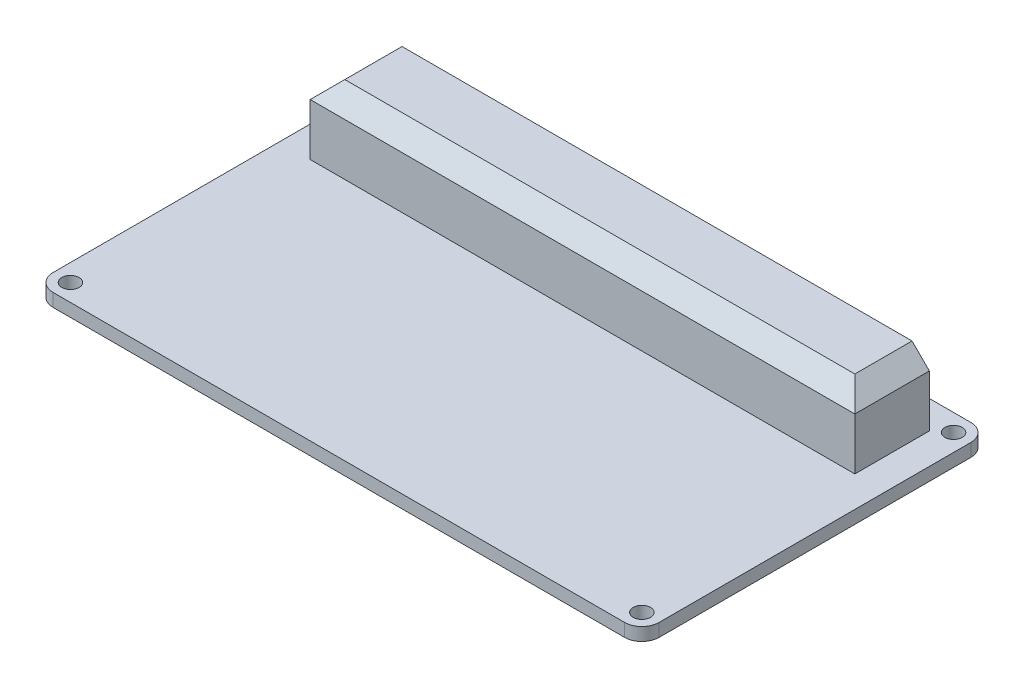
ISO-10303-21;
HEADER;
FILE_DESCRIPTION(('STEP AP214'),'2;1');
FILE_NAME('part.step','',(''),(''),'','','');
FILE_SCHEMA(('AUTOMOTIVE_DESIGN { 1 0 10303 214 1 1 1 1 }'));
ENDSEC;
DATA;
#1=APPLICATION_CONTEXT('core data for automotive mechanical design processes');
#2=APPLICATION_PROTOCOL_DEFINITION('international standard','automotive_design',2000,#1);
#3=PRODUCT_CONTEXT('',#1,'mechanical');
#4=PRODUCT('Part','Part','',(#3));
#5=PRODUCT_RELATED_PRODUCT_CATEGORY('part','',(#4));
#6=PRODUCT_DEFINITION_FORMATION('','',#4);
#7=PRODUCT_DEFINITION_CONTEXT('part definition',#1,'design');
#8=PRODUCT_DEFINITION('design','',#6,#7);
#9=PRODUCT_DEFINITION_SHAPE('','',#8);
#10=(LENGTH_UNIT() NAMED_UNIT(*) SI_UNIT(.MILLI.,.METRE.));
#11=(NAMED_UNIT(*) PLANE_ANGLE_UNIT() SI_UNIT($,.RADIAN.));
#12=(NAMED_UNIT(*) SI_UNIT($,.STERADIAN.) SOLID_ANGLE_UNIT());
#13=UNCERTAINTY_MEASURE_WITH_UNIT(LENGTH_MEASURE(1.E-05),#10,'distance_accuracy_value','');
#14=(GEOMETRIC_REPRESENTATION_CONTEXT(3) GLOBAL_UNCERTAINTY_ASSIGNED_CONTEXT((#13)) GLOBAL_UNIT_ASSIGNED_CONTEXT((#10,
#11,#12)) REPRESENTATION_CONTEXT('',''));
#15=CARTESIAN_POINT('',(0.,0.,0.));
#16=DIRECTION('',(0.,0.,1.));
#17=DIRECTION('',(1.,0.,0.));
#18=AXIS2_PLACEMENT_3D('',#15,#16,#17);
#19=CARTESIAN_POINT('',(0.,1.5,0.));
#20=DIRECTION('',(0.,-1.,0.));
#21=DIRECTION('',(0.,0.,-1.));
#22=AXIS2_PLACEMENT_3D('',#19,#20,#21);
#23=PLANE('',#22);
#24=CARTESIAN_POINT('',(33.,1.5,18.));
#25=DIRECTION('',(0.,1.,0.));
#26=DIRECTION('',(0.,0.,1.));
#27=AXIS2_PLACEMENT_3D('',#24,#25,#26);
#28=CIRCLE('',#27,0.999999999999998);
#29=CARTESIAN_POINT('',(33.,1.5,19.));
#30=VERTEX_POINT('',#29);
#31=EDGE_CURVE('E547',#30,#30,#28,.T.);
#32=ORIENTED_EDGE('',*,*,#31,.F.);
#33=EDGE_LOOP('',(#32));
#34=FACE_BOUND('',#33,.T.);
#35=CARTESIAN_POINT('',(33.,1.5,-18.));
#36=DIRECTION('',(0.,1.,0.));
#37=DIRECTION('',(0.,0.,1.));
#38=AXIS2_PLACEMENT_3D('',#35,#36,#37);
#39=CIRCLE('',#38,0.999999999999998);
#40=CARTESIAN_POINT('',(33.,1.5,-17.));
#41=VERTEX_POINT('',#40);
#42=EDGE_CURVE('E553',#41,#41,#39,.T.);
#43=ORIENTED_EDGE('',*,*,#42,.F.);
#44=EDGE_LOOP('',(#43));
#45=FACE_BOUND('',#44,.T.);
#46=CARTESIAN_POINT('',(-33.,1.5,-18.));
#47=DIRECTION('',(0.,1.,0.));
#48=DIRECTION('',(0.,0.,1.));
#49=AXIS2_PLACEMENT_3D('',#46,#47,#48);
#50=CIRCLE('',#49,0.999999999999998);
#51=CARTESIAN_POINT('',(-33.,1.5,-17.));
#52=VERTEX_POINT('',#51);
#53=EDGE_CURVE('E541',#52,#52,#50,.T.);
#54=ORIENTED_EDGE('',*,*,#53,.F.);
#55=EDGE_LOOP('',(#54));
#56=FACE_BOUND('',#55,.T.);
#57=CARTESIAN_POINT('',(-33.,1.5,18.));
#58=DIRECTION('',(0.,1.,0.));
#59=DIRECTION('',(0.,0.,1.));
#60=AXIS2_PLACEMENT_3D('',#57,#58,#59);
#61=CIRCLE('',#60,0.999999999999998);
#62=CARTESIAN_POINT('',(-33.,1.5,19.));
#63=VERTEX_POINT('',#62);
#64=EDGE_CURVE('E538',#63,#63,#61,.T.);
#65=ORIENTED_EDGE('',*,*,#64,.F.);
#66=EDGE_LOOP('',(#65));
#67=FACE_BOUND('',#66,.T.);
#68=DIRECTION('',(-1.,0.,0.));
#69=VECTOR('',#68,1.);
#70=CARTESIAN_POINT('',(-35.,1.5,-20.));
#71=LINE('',#70,#69);
#72=CARTESIAN_POINT('',(33.,1.5,-20.));
#73=VERTEX_POINT('',#72);
#74=CARTESIAN_POINT('',(-33.,1.5,-20.));
#75=VERTEX_POINT('',#74);
#76=EDGE_CURVE('E187',#73,#75,#71,.T.);
#77=ORIENTED_EDGE('',*,*,#76,.T.);
#78=CARTESIAN_POINT('',(-33.,1.5,-18.));
#79=DIRECTION('',(0.,-1.,0.));
#80=DIRECTION('',(0.,0.,-1.));
#81=AXIS2_PLACEMENT_3D('',#78,#79,#80);
#82=CIRCLE('',#81,2.);
#83=CARTESIAN_POINT('',(-35.,1.5,-18.));
#84=VERTEX_POINT('',#83);
#85=EDGE_CURVE('E248',#75,#84,#82,.F.);
#86=ORIENTED_EDGE('',*,*,#85,.T.);
#87=DIRECTION('',(0.,0.,1.));
#88=VECTOR('',#87,1.);
#89=CARTESIAN_POINT('',(-35.,1.5,20.));
#90=LINE('',#89,#88);
#91=CARTESIAN_POINT('',(-35.,1.5,18.));
#92=VERTEX_POINT('',#91);
#93=EDGE_CURVE('E191',#84,#92,#90,.T.);
#94=ORIENTED_EDGE('',*,*,#93,.T.);
#95=CARTESIAN_POINT('',(-33.,1.5,18.));
#96=DIRECTION('',(0.,-1.,0.));
#97=DIRECTION('',(0.,0.,-1.));
#98=AXIS2_PLACEMENT_3D('',#95,#96,#97);
#99=CIRCLE('',#98,2.);
#100=CARTESIAN_POINT('',(-33.,1.5,20.));
#101=VERTEX_POINT('',#100);
#102=EDGE_CURVE('E65',#92,#101,#99,.F.);
#103=ORIENTED_EDGE('',*,*,#102,.T.);
#104=DIRECTION('',(1.,0.,0.));
#105=VECTOR('',#104,1.);
#106=CARTESIAN_POINT('',(-35.,1.5,20.));
#107=LINE('',#106,#105);
#108=CARTESIAN_POINT('',(33.,1.5,20.));
#109=VERTEX_POINT('',#108);
#110=EDGE_CURVE('E193',#101,#109,#107,.T.);
#111=ORIENTED_EDGE('',*,*,#110,.T.);
#112=CARTESIAN_POINT('',(33.,1.5,18.));
#113=DIRECTION('',(0.,-1.,0.));
#114=DIRECTION('',(0.,0.,-1.));
#115=AXIS2_PLACEMENT_3D('',#112,#113,#114);
#116=CIRCLE('',#115,2.);
#117=CARTESIAN_POINT('',(35.,1.5,18.));
#118=VERTEX_POINT('',#117);
#119=EDGE_CURVE('E244',#109,#118,#116,.F.);
#120=ORIENTED_EDGE('',*,*,#119,.T.);
#121=DIRECTION('',(0.,0.,-1.));
#122=VECTOR('',#121,1.);
#123=CARTESIAN_POINT('',(35.,1.5,20.));
#124=LINE('',#123,#122);
#125=CARTESIAN_POINT('',(35.,1.5,-18.));
#126=VERTEX_POINT('',#125);
#127=EDGE_CURVE('E184',#118,#126,#124,.T.);
#128=ORIENTED_EDGE('',*,*,#127,.T.);
#129=CARTESIAN_POINT('',(33.,1.5,-18.));
#130=DIRECTION('',(0.,-1.,0.));
#131=DIRECTION('',(0.,0.,-1.));
#132=AXIS2_PLACEMENT_3D('',#129,#130,#131);
#133=CIRCLE('',#132,2.);
#134=EDGE_CURVE('E246',#126,#73,#133,.F.);
#135=ORIENTED_EDGE('',*,*,#134,.T.);
#136=EDGE_LOOP('',(#77,#86,#94,#103,#111,#120,#128,#135));
#137=FACE_BOUND('',#136,.T.);
#138=DIRECTION('',(0.,0.,-1.));
#139=VECTOR('',#138,1.);
#140=CARTESIAN_POINT('',(31.4532794988003,1.5,-8.14369626517676));
#141=LINE('',#140,#139);
#142=CARTESIAN_POINT('',(31.4532794988003,1.5,-8.14369626517676));
#143=VERTEX_POINT('',#142);
#144=CARTESIAN_POINT('',(31.4532794988003,1.5,-16.7527571604066));
#145=VERTEX_POINT('',#144);
#146=EDGE_CURVE('E150',#143,#145,#141,.T.);
#147=ORIENTED_EDGE('',*,*,#146,.F.);
#148=DIRECTION('',(1.,0.,0.));
#149=VECTOR('',#148,1.);
#150=CARTESIAN_POINT('',(-31.4532794988003,1.5,-8.14369626517676));
#151=LINE('',#150,#149);
#152=CARTESIAN_POINT('',(-31.4532794988003,1.5,-8.14369626517676));
#153=VERTEX_POINT('',#152);
#154=EDGE_CURVE('E163',#153,#143,#151,.T.);
#155=ORIENTED_EDGE('',*,*,#154,.F.);
#156=DIRECTION('',(0.,0.,1.));
#157=VECTOR('',#156,1.);
#158=CARTESIAN_POINT('',(-31.4532794988003,1.5,-8.14369626517676));
#159=LINE('',#158,#157);
#160=CARTESIAN_POINT('',(-31.4532794988003,1.5,-16.7527571604066));
#161=VERTEX_POINT('',#160);
#162=EDGE_CURVE('E171',#161,#153,#159,.T.);
#163=ORIENTED_EDGE('',*,*,#162,.F.);
#164=DIRECTION('',(-1.,0.,0.));
#165=VECTOR('',#164,1.);
#166=CARTESIAN_POINT('',(-31.4532794988003,1.5,-16.7527571604066));
#167=LINE('',#166,#165);
#168=EDGE_CURVE('E166',#145,#161,#167,.T.);
#169=ORIENTED_EDGE('',*,*,#168,.F.);
#170=EDGE_LOOP('',(#147,#155,#163,#169));
#171=FACE_BOUND('',#170,.T.);
#172=ADVANCED_FACE('F45',(#34,#45,#56,#67,#137,#171),#23,.F.);
#173=CARTESIAN_POINT('',(35.,1.5,20.));
#174=DIRECTION('',(-1.,0.,0.));
#175=DIRECTION('',(0.,0.,1.));
#176=AXIS2_PLACEMENT_3D('',#173,#174,#175);
#177=PLANE('',#176);
#178=DIRECTION('',(0.,0.,-1.));
#179=VECTOR('',#178,1.);
#180=CARTESIAN_POINT('',(35.,0.,20.));
#181=LINE('',#180,#179);
#182=CARTESIAN_POINT('',(35.,0.,18.));
#183=VERTEX_POINT('',#182);
#184=CARTESIAN_POINT('',(35.,0.,-18.));
#185=VERTEX_POINT('',#184);
#186=EDGE_CURVE('E183',#183,#185,#181,.T.);
#187=ORIENTED_EDGE('',*,*,#186,.T.);
#188=DIRECTION('',(0.,-1.,0.));
#189=VECTOR('',#188,1.);
#190=CARTESIAN_POINT('',(35.,1.5,-18.));
#191=LINE('',#190,#189);
#192=EDGE_CURVE('E253',#185,#126,#191,.F.);
#193=ORIENTED_EDGE('',*,*,#192,.T.);
#194=ORIENTED_EDGE('',*,*,#127,.F.);
#195=DIRECTION('',(0.,-1.,0.));
#196=VECTOR('',#195,1.);
#197=CARTESIAN_POINT('',(35.,1.5,18.));
#198=LINE('',#197,#196);
#199=EDGE_CURVE('E250',#118,#183,#198,.T.);
#200=ORIENTED_EDGE('',*,*,#199,.T.);
#201=EDGE_LOOP('',(#187,#193,#194,#200));
#202=FACE_BOUND('',#201,.T.);
#203=ADVANCED_FACE('F269',(#202),#177,.F.);
#204=CARTESIAN_POINT('',(-35.,1.5,-20.));
#205=DIRECTION('',(0.,0.,1.));
#206=DIRECTION('',(1.,0.,0.));
#207=AXIS2_PLACEMENT_3D('',#204,#205,#206);
#208=PLANE('',#207);
#209=DIRECTION('',(-1.,0.,0.));
#210=VECTOR('',#209,1.);
#211=CARTESIAN_POINT('',(-35.,0.,-20.));
#212=LINE('',#211,#210);
#213=CARTESIAN_POINT('',(33.,0.,-20.));
#214=VERTEX_POINT('',#213);
#215=CARTESIAN_POINT('',(-33.,0.,-20.));
#216=VERTEX_POINT('',#215);
#217=EDGE_CURVE('E198',#214,#216,#212,.T.);
#218=ORIENTED_EDGE('',*,*,#217,.T.);
#219=DIRECTION('',(0.,-1.,0.));
#220=VECTOR('',#219,1.);
#221=CARTESIAN_POINT('',(-33.,1.5,-20.));
#222=LINE('',#221,#220);
#223=EDGE_CURVE('E241',#216,#75,#222,.F.);
#224=ORIENTED_EDGE('',*,*,#223,.T.);
#225=ORIENTED_EDGE('',*,*,#76,.F.);
#226=DIRECTION('',(0.,-1.,0.));
#227=VECTOR('',#226,1.);
#228=CARTESIAN_POINT('',(33.,1.5,-20.));
#229=LINE('',#228,#227);
#230=EDGE_CURVE('E238',#73,#214,#229,.T.);
#231=ORIENTED_EDGE('',*,*,#230,.T.);
#232=EDGE_LOOP('',(#218,#224,#225,#231));
#233=FACE_BOUND('',#232,.T.);
#234=ADVANCED_FACE('F278',(#233),#208,.F.);
#235=CARTESIAN_POINT('',(-35.,1.5,20.));
#236=DIRECTION('',(1.,0.,0.));
#237=DIRECTION('',(0.,0.,-1.));
#238=AXIS2_PLACEMENT_3D('',#235,#236,#237);
#239=PLANE('',#238);
#240=ORIENTED_EDGE('',*,*,#93,.F.);
#241=DIRECTION('',(0.,-1.,0.));
#242=VECTOR('',#241,1.);
#243=CARTESIAN_POINT('',(-35.,1.5,-18.));
#244=LINE('',#243,#242);
#245=CARTESIAN_POINT('',(-35.,0.,-18.));
#246=VERTEX_POINT('',#245);
#247=EDGE_CURVE('E227',#84,#246,#244,.T.);
#248=ORIENTED_EDGE('',*,*,#247,.T.);
#249=DIRECTION('',(0.,0.,1.));
#250=VECTOR('',#249,1.);
#251=CARTESIAN_POINT('',(-35.,0.,20.));
#252=LINE('',#251,#250);
#253=CARTESIAN_POINT('',(-35.,0.,18.));
#254=VERTEX_POINT('',#253);
#255=EDGE_CURVE('E201',#246,#254,#252,.T.);
#256=ORIENTED_EDGE('',*,*,#255,.T.);
#257=DIRECTION('',(0.,-1.,0.));
#258=VECTOR('',#257,1.);
#259=CARTESIAN_POINT('',(-35.,1.5,18.));
#260=LINE('',#259,#258);
#261=EDGE_CURVE('E220',#254,#92,#260,.F.);
#262=ORIENTED_EDGE('',*,*,#261,.T.);
#263=EDGE_LOOP('',(#240,#248,#256,#262));
#264=FACE_BOUND('',#263,.T.);
#265=ADVANCED_FACE('F286',(#264),#239,.F.);
#266=CARTESIAN_POINT('',(-35.,1.5,20.));
#267=DIRECTION('',(0.,0.,-1.));
#268=DIRECTION('',(-1.,0.,0.));
#269=AXIS2_PLACEMENT_3D('',#266,#267,#268);
#270=PLANE('',#269);
#271=DIRECTION('',(1.,0.,0.));
#272=VECTOR('',#271,1.);
#273=CARTESIAN_POINT('',(-35.,0.,20.));
#274=LINE('',#273,#272);
#275=CARTESIAN_POINT('',(-33.,0.,20.));
#276=VERTEX_POINT('',#275);
#277=CARTESIAN_POINT('',(33.,0.,20.));
#278=VERTEX_POINT('',#277);
#279=EDGE_CURVE('E188',#276,#278,#274,.T.);
#280=ORIENTED_EDGE('',*,*,#279,.T.);
#281=DIRECTION('',(0.,-1.,0.));
#282=VECTOR('',#281,1.);
#283=CARTESIAN_POINT('',(33.,1.5,20.));
#284=LINE('',#283,#282);
#285=EDGE_CURVE('E11',#278,#109,#284,.F.);
#286=ORIENTED_EDGE('',*,*,#285,.T.);
#287=ORIENTED_EDGE('',*,*,#110,.F.);
#288=DIRECTION('',(0.,-1.,0.));
#289=VECTOR('',#288,1.);
#290=CARTESIAN_POINT('',(-33.,1.5,20.));
#291=LINE('',#290,#289);
#292=EDGE_CURVE('E53',#101,#276,#291,.T.);
#293=ORIENTED_EDGE('',*,*,#292,.T.);
#294=EDGE_LOOP('',(#280,#286,#287,#293));
#295=FACE_BOUND('',#294,.T.);
#296=ADVANCED_FACE('F257',(#295),#270,.F.);
#297=CARTESIAN_POINT('',(0.,0.,0.));
#298=DIRECTION('',(0.,-1.,0.));
#299=DIRECTION('',(0.,0.,-1.));
#300=AXIS2_PLACEMENT_3D('',#297,#298,#299);
#301=PLANE('',#300);
#302=CARTESIAN_POINT('',(33.,0.,18.));
#303=DIRECTION('',(0.,1.,0.));
#304=DIRECTION('',(0.,0.,1.));
#305=AXIS2_PLACEMENT_3D('',#302,#303,#304);
#306=CIRCLE('',#305,0.999999999999998);
#307=CARTESIAN_POINT('',(33.,0.,19.));
#308=VERTEX_POINT('',#307);
#309=EDGE_CURVE('E544',#308,#308,#306,.T.);
#310=ORIENTED_EDGE('',*,*,#309,.T.);
#311=EDGE_LOOP('',(#310));
#312=FACE_BOUND('',#311,.T.);
#313=CARTESIAN_POINT('',(33.,0.,-18.));
#314=DIRECTION('',(0.,1.,0.));
#315=DIRECTION('',(0.,0.,1.));
#316=AXIS2_PLACEMENT_3D('',#313,#314,#315);
#317=CIRCLE('',#316,0.999999999999998);
#318=CARTESIAN_POINT('',(33.,0.,-17.));
#319=VERTEX_POINT('',#318);
#320=EDGE_CURVE('E550',#319,#319,#317,.T.);
#321=ORIENTED_EDGE('',*,*,#320,.T.);
#322=EDGE_LOOP('',(#321));
#323=FACE_BOUND('',#322,.T.);
#324=CARTESIAN_POINT('',(-33.,0.,-18.));
#325=DIRECTION('',(0.,1.,0.));
#326=DIRECTION('',(0.,0.,1.));
#327=AXIS2_PLACEMENT_3D('',#324,#325,#326);
#328=CIRCLE('',#327,0.999999999999998);
#329=CARTESIAN_POINT('',(-33.,0.,-17.));
#330=VERTEX_POINT('',#329);
#331=EDGE_CURVE('E556',#330,#330,#328,.T.);
#332=ORIENTED_EDGE('',*,*,#331,.T.);
#333=EDGE_LOOP('',(#332));
#334=FACE_BOUND('',#333,.T.);
#335=CARTESIAN_POINT('',(-33.,0.,18.));
#336=DIRECTION('',(0.,1.,0.));
#337=DIRECTION('',(0.,0.,1.));
#338=AXIS2_PLACEMENT_3D('',#335,#336,#337);
#339=CIRCLE('',#338,0.999999999999998);
#340=CARTESIAN_POINT('',(-33.,0.,19.));
#341=VERTEX_POINT('',#340);
#342=EDGE_CURVE('E223',#341,#341,#339,.T.);
#343=ORIENTED_EDGE('',*,*,#342,.T.);
#344=EDGE_LOOP('',(#343));
#345=FACE_BOUND('',#344,.T.);
#346=ORIENTED_EDGE('',*,*,#255,.F.);
#347=CARTESIAN_POINT('',(-33.,0.,-18.));
#348=DIRECTION('',(0.,-1.,0.));
#349=DIRECTION('',(0.,0.,-1.));
#350=AXIS2_PLACEMENT_3D('',#347,#348,#349);
#351=CIRCLE('',#350,2.);
#352=EDGE_CURVE('E236',#246,#216,#351,.T.);
#353=ORIENTED_EDGE('',*,*,#352,.T.);
#354=ORIENTED_EDGE('',*,*,#217,.F.);
#355=CARTESIAN_POINT('',(33.,0.,-18.));
#356=DIRECTION('',(0.,-1.,0.));
#357=DIRECTION('',(0.,0.,-1.));
#358=AXIS2_PLACEMENT_3D('',#355,#356,#357);
#359=CIRCLE('',#358,2.);
#360=EDGE_CURVE('E234',#214,#185,#359,.T.);
#361=ORIENTED_EDGE('',*,*,#360,.T.);
#362=ORIENTED_EDGE('',*,*,#186,.F.);
#363=CARTESIAN_POINT('',(33.,0.,18.));
#364=DIRECTION('',(0.,-1.,0.));
#365=DIRECTION('',(0.,0.,-1.));
#366=AXIS2_PLACEMENT_3D('',#363,#364,#365);
#367=CIRCLE('',#366,2.);
#368=EDGE_CURVE('E232',#183,#278,#367,.T.);
#369=ORIENTED_EDGE('',*,*,#368,.T.);
#370=ORIENTED_EDGE('',*,*,#279,.F.);
#371=CARTESIAN_POINT('',(-33.,0.,18.));
#372=DIRECTION('',(0.,-1.,0.));
#373=DIRECTION('',(0.,0.,-1.));
#374=AXIS2_PLACEMENT_3D('',#371,#372,#373);
#375=CIRCLE('',#374,2.);
#376=EDGE_CURVE('E230',#276,#254,#375,.T.);
#377=ORIENTED_EDGE('',*,*,#376,.T.);
#378=EDGE_LOOP('',(#346,#353,#354,#361,#362,#369,#370,#377));
#379=FACE_BOUND('',#378,.T.);
#380=ADVANCED_FACE('F261',(#312,#323,#334,#345,#379),#301,.T.);
#381=CARTESIAN_POINT('',(31.4532794988003,9.5,-8.14369626517676));
#382=DIRECTION('',(-1.,0.,0.));
#383=DIRECTION('',(0.,0.,1.));
#384=AXIS2_PLACEMENT_3D('',#381,#382,#383);
#385=PLANE('',#384);
#386=DIRECTION('',(0.,-1.,0.));
#387=VECTOR('',#386,1.);
#388=CARTESIAN_POINT('',(31.4532794988003,9.5,-16.7527571604066));
#389=LINE('',#388,#387);
#390=CARTESIAN_POINT('',(31.4532794988003,7.5,-16.7527571604066));
#391=VERTEX_POINT('',#390);
#392=EDGE_CURVE('E181',#391,#145,#389,.T.);
#393=ORIENTED_EDGE('',*,*,#392,.F.);
#394=DIRECTION('',(0.,0.,1.));
#395=VECTOR('',#394,1.);
#396=CARTESIAN_POINT('',(31.4532794988003,7.5,-8.14369626517676));
#397=LINE('',#396,#395);
#398=CARTESIAN_POINT('',(31.4532794988003,7.5,-8.14369626517676));
#399=VERTEX_POINT('',#398);
#400=EDGE_CURVE('E152',#391,#399,#397,.T.);
#401=ORIENTED_EDGE('',*,*,#400,.T.);
#402=DIRECTION('',(0.,-1.,0.));
#403=VECTOR('',#402,1.);
#404=CARTESIAN_POINT('',(31.4532794988003,9.5,-8.14369626517676));
#405=LINE('',#404,#403);
#406=EDGE_CURVE('E146',#399,#143,#405,.T.);
#407=ORIENTED_EDGE('',*,*,#406,.T.);
#408=ORIENTED_EDGE('',*,*,#146,.T.);
#409=EDGE_LOOP('',(#393,#401,#407,#408));
#410=FACE_BOUND('',#409,.T.);
#411=ADVANCED_FACE('F149',(#410),#385,.F.);
#412=CARTESIAN_POINT('',(-31.4532794988003,9.5,-16.7527571604066));
#413=DIRECTION('',(0.,0.,1.));
#414=DIRECTION('',(1.,0.,0.));
#415=AXIS2_PLACEMENT_3D('',#412,#413,#414);
#416=PLANE('',#415);
#417=DIRECTION('',(0.,-1.,0.));
#418=VECTOR('',#417,1.);
#419=CARTESIAN_POINT('',(-31.4532794988003,9.5,-16.7527571604066));
#420=LINE('',#419,#418);
#421=CARTESIAN_POINT('',(-31.4532794988003,7.5,-16.7527571604066));
#422=VERTEX_POINT('',#421);
#423=EDGE_CURVE('E179',#422,#161,#420,.T.);
#424=ORIENTED_EDGE('',*,*,#423,.F.);
#425=DIRECTION('',(-0.707106781186548,-0.707106781186548,0.));
#426=VECTOR('',#425,1.);
#427=CARTESIAN_POINT('',(-29.4532794988003,9.5,-16.7527571604066));
#428=LINE('',#427,#426);
#429=CARTESIAN_POINT('',(-29.4532794988003,9.5,-16.7527571604066));
#430=VERTEX_POINT('',#429);
#431=EDGE_CURVE('E215',#422,#430,#428,.F.);
#432=ORIENTED_EDGE('',*,*,#431,.T.);
#433=DIRECTION('',(-1.,0.,0.));
#434=VECTOR('',#433,1.);
#435=CARTESIAN_POINT('',(-31.4532794988003,9.5,-16.7527571604066));
#436=LINE('',#435,#434);
#437=CARTESIAN_POINT('',(29.4532794988003,9.5,-16.7527571604066));
#438=VERTEX_POINT('',#437);
#439=EDGE_CURVE('E157',#438,#430,#436,.T.);
#440=ORIENTED_EDGE('',*,*,#439,.F.);
#441=DIRECTION('',(-0.707106781186548,0.707106781186548,0.));
#442=VECTOR('',#441,1.);
#443=CARTESIAN_POINT('',(29.4532794988003,9.5,-16.7527571604066));
#444=LINE('',#443,#442);
#445=EDGE_CURVE('E213',#438,#391,#444,.F.);
#446=ORIENTED_EDGE('',*,*,#445,.T.);
#447=ORIENTED_EDGE('',*,*,#392,.T.);
#448=ORIENTED_EDGE('',*,*,#168,.T.);
#449=EDGE_LOOP('',(#424,#432,#440,#446,#447,#448));
#450=FACE_BOUND('',#449,.T.);
#451=ADVANCED_FACE('F437',(#450),#416,.F.);
#452=CARTESIAN_POINT('',(-31.4532794988003,9.5,-8.14369626517676));
#453=DIRECTION('',(1.,0.,0.));
#454=DIRECTION('',(0.,0.,-1.));
#455=AXIS2_PLACEMENT_3D('',#452,#453,#454);
#456=PLANE('',#455);
#457=DIRECTION('',(0.,-1.,0.));
#458=VECTOR('',#457,1.);
#459=CARTESIAN_POINT('',(-31.4532794988003,9.5,-8.14369626517676));
#460=LINE('',#459,#458);
#461=CARTESIAN_POINT('',(-31.4532794988003,7.5,-8.14369626517676));
#462=VERTEX_POINT('',#461);
#463=EDGE_CURVE('E156',#462,#153,#460,.T.);
#464=ORIENTED_EDGE('',*,*,#463,.F.);
#465=DIRECTION('',(0.,0.,-1.));
#466=VECTOR('',#465,1.);
#467=CARTESIAN_POINT('',(-31.4532794988003,7.5,-8.14369626517676));
#468=LINE('',#467,#466);
#469=EDGE_CURVE('E211',#462,#422,#468,.T.);
#470=ORIENTED_EDGE('',*,*,#469,.T.);
#471=ORIENTED_EDGE('',*,*,#423,.T.);
#472=ORIENTED_EDGE('',*,*,#162,.T.);
#473=EDGE_LOOP('',(#464,#470,#471,#472));
#474=FACE_BOUND('',#473,.T.);
#475=ADVANCED_FACE('F428',(#474),#456,.F.);
#476=CARTESIAN_POINT('',(-31.4532794988003,9.5,-8.14369626517676));
#477=DIRECTION('',(0.,0.,-1.));
#478=DIRECTION('',(-1.,0.,0.));
#479=AXIS2_PLACEMENT_3D('',#476,#477,#478);
#480=PLANE('',#479);
#481=ORIENTED_EDGE('',*,*,#406,.F.);
#482=DIRECTION('',(-1.,0.,0.));
#483=VECTOR('',#482,1.);
#484=CARTESIAN_POINT('',(-31.4532794988003,7.5,-8.14369626517676));
#485=LINE('',#484,#483);
#486=EDGE_CURVE('E218',#399,#462,#485,.T.);
#487=ORIENTED_EDGE('',*,*,#486,.T.);
#488=ORIENTED_EDGE('',*,*,#463,.T.);
#489=ORIENTED_EDGE('',*,*,#154,.T.);
#490=EDGE_LOOP('',(#481,#487,#488,#489));
#491=FACE_BOUND('',#490,.T.);
#492=ADVANCED_FACE('F169',(#491),#480,.F.);
#493=CARTESIAN_POINT('',(0.,9.5,0.));
#494=DIRECTION('',(0.,-1.,0.));
#495=DIRECTION('',(0.,0.,-1.));
#496=AXIS2_PLACEMENT_3D('',#493,#494,#495);
#497=PLANE('',#496);
#498=ORIENTED_EDGE('',*,*,#439,.T.);
#499=DIRECTION('',(0.,0.,1.));
#500=VECTOR('',#499,1.);
#501=CARTESIAN_POINT('',(-29.4532794988003,9.5,0.));
#502=LINE('',#501,#500);
#503=CARTESIAN_POINT('',(-29.4532794988003,9.5,-10.1436962651768));
#504=VERTEX_POINT('',#503);
#505=EDGE_CURVE('E208',#430,#504,#502,.T.);
#506=ORIENTED_EDGE('',*,*,#505,.T.);
#507=DIRECTION('',(1.,0.,0.));
#508=VECTOR('',#507,1.);
#509=CARTESIAN_POINT('',(0.,9.5,-10.1436962651768));
#510=LINE('',#509,#508);
#511=CARTESIAN_POINT('',(29.4532794988003,9.5,-10.1436962651768));
#512=VERTEX_POINT('',#511);
#513=EDGE_CURVE('E195',#504,#512,#510,.T.);
#514=ORIENTED_EDGE('',*,*,#513,.T.);
#515=DIRECTION('',(0.,0.,-1.));
#516=VECTOR('',#515,1.);
#517=CARTESIAN_POINT('',(29.4532794988003,9.5,0.));
#518=LINE('',#517,#516);
#519=EDGE_CURVE('E206',#512,#438,#518,.T.);
#520=ORIENTED_EDGE('',*,*,#519,.T.);
#521=EDGE_LOOP('',(#498,#506,#514,#520));
#522=FACE_BOUND('',#521,.T.);
#523=ADVANCED_FACE('F335',(#522),#497,.F.);
#524=CARTESIAN_POINT('',(29.4532794988003,9.5,0.));
#525=DIRECTION('',(-0.707106781186547,-0.707106781186547,0.));
#526=DIRECTION('',(0.,0.,-1.));
#527=AXIS2_PLACEMENT_3D('',#524,#525,#526);
#528=PLANE('',#527);
#529=ORIENTED_EDGE('',*,*,#445,.F.);
#530=ORIENTED_EDGE('',*,*,#519,.F.);
#531=DIRECTION('',(-0.577350269189626,0.577350269189626,-0.577350269189626));
#532=VECTOR('',#531,1.);
#533=CARTESIAN_POINT('',(19.6355196658669,19.3177598329334,-19.9614560981102));
#534=LINE('',#533,#532);
#535=EDGE_CURVE('E167',#399,#512,#534,.T.);
#536=ORIENTED_EDGE('',*,*,#535,.F.);
#537=ORIENTED_EDGE('',*,*,#400,.F.);
#538=EDGE_LOOP('',(#529,#530,#536,#537));
#539=FACE_BOUND('',#538,.T.);
#540=ADVANCED_FACE('F329',(#539),#528,.F.);
#541=CARTESIAN_POINT('',(0.,9.5,-10.1436962651768));
#542=DIRECTION('',(0.,-0.707106781186547,-0.707106781186547));
#543=DIRECTION('',(1.,0.,0.));
#544=AXIS2_PLACEMENT_3D('',#541,#542,#543);
#545=PLANE('',#544);
#546=ORIENTED_EDGE('',*,*,#535,.T.);
#547=ORIENTED_EDGE('',*,*,#513,.F.);
#548=DIRECTION('',(-0.577350269189626,-0.577350269189626,0.577350269189626));
#549=VECTOR('',#548,1.);
#550=CARTESIAN_POINT('',(-19.6355196658669,19.3177598329334,-19.9614560981102));
#551=LINE('',#550,#549);
#552=EDGE_CURVE('E221',#462,#504,#551,.F.);
#553=ORIENTED_EDGE('',*,*,#552,.F.);
#554=ORIENTED_EDGE('',*,*,#486,.F.);
#555=EDGE_LOOP('',(#546,#547,#553,#554));
#556=FACE_BOUND('',#555,.T.);
#557=ADVANCED_FACE('F322',(#556),#545,.F.);
#558=CARTESIAN_POINT('',(-29.4532794988003,9.5,0.));
#559=DIRECTION('',(0.707106781186547,-0.707106781186547,0.));
#560=DIRECTION('',(0.,0.,1.));
#561=AXIS2_PLACEMENT_3D('',#558,#559,#560);
#562=PLANE('',#561);
#563=ORIENTED_EDGE('',*,*,#431,.F.);
#564=ORIENTED_EDGE('',*,*,#469,.F.);
#565=ORIENTED_EDGE('',*,*,#552,.T.);
#566=ORIENTED_EDGE('',*,*,#505,.F.);
#567=EDGE_LOOP('',(#563,#564,#565,#566));
#568=FACE_BOUND('',#567,.T.);
#569=ADVANCED_FACE('F315',(#568),#562,.F.);
#570=CARTESIAN_POINT('',(-33.,0.,18.));
#571=DIRECTION('',(0.,1.,0.));
#572=DIRECTION('',(0.,0.,1.));
#573=AXIS2_PLACEMENT_3D('',#570,#571,#572);
#574=CYLINDRICAL_SURFACE('',#573,0.999999999999998);
#575=ORIENTED_EDGE('',*,*,#342,.F.);
#576=EDGE_LOOP('',(#575));
#577=FACE_BOUND('',#576,.T.);
#578=ORIENTED_EDGE('',*,*,#64,.T.);
#579=EDGE_LOOP('',(#578));
#580=FACE_BOUND('',#579,.T.);
#581=ADVANCED_FACE('F321',(#577,#580),#574,.F.);
#582=CARTESIAN_POINT('',(-33.,0.,-18.));
#583=DIRECTION('',(0.,1.,0.));
#584=DIRECTION('',(0.,0.,1.));
#585=AXIS2_PLACEMENT_3D('',#582,#583,#584);
#586=CYLINDRICAL_SURFACE('',#585,0.999999999999998);
#587=ORIENTED_EDGE('',*,*,#331,.F.);
#588=EDGE_LOOP('',(#587));
#589=FACE_BOUND('',#588,.T.);
#590=ORIENTED_EDGE('',*,*,#53,.T.);
#591=EDGE_LOOP('',(#590));
#592=FACE_BOUND('',#591,.T.);
#593=ADVANCED_FACE('F376',(#589,#592),#586,.F.);
#594=CARTESIAN_POINT('',(33.,0.,-18.));
#595=DIRECTION('',(0.,1.,0.));
#596=DIRECTION('',(0.,0.,1.));
#597=AXIS2_PLACEMENT_3D('',#594,#595,#596);
#598=CYLINDRICAL_SURFACE('',#597,0.999999999999998);
#599=ORIENTED_EDGE('',*,*,#320,.F.);
#600=EDGE_LOOP('',(#599));
#601=FACE_BOUND('',#600,.T.);
#602=ORIENTED_EDGE('',*,*,#42,.T.);
#603=EDGE_LOOP('',(#602));
#604=FACE_BOUND('',#603,.T.);
#605=ADVANCED_FACE('F367',(#601,#604),#598,.F.);
#606=CARTESIAN_POINT('',(33.,0.,18.));
#607=DIRECTION('',(0.,1.,0.));
#608=DIRECTION('',(0.,0.,1.));
#609=AXIS2_PLACEMENT_3D('',#606,#607,#608);
#610=CYLINDRICAL_SURFACE('',#609,0.999999999999998);
#611=ORIENTED_EDGE('',*,*,#309,.F.);
#612=EDGE_LOOP('',(#611));
#613=FACE_BOUND('',#612,.T.);
#614=ORIENTED_EDGE('',*,*,#31,.T.);
#615=EDGE_LOOP('',(#614));
#616=FACE_BOUND('',#615,.T.);
#617=ADVANCED_FACE('F339',(#613,#616),#610,.F.);
#618=CARTESIAN_POINT('',(-33.,1.5,-18.));
#619=DIRECTION('',(0.,-1.,0.));
#620=DIRECTION('',(0.,0.,-1.));
#621=AXIS2_PLACEMENT_3D('',#618,#619,#620);
#622=CYLINDRICAL_SURFACE('',#621,2.);
#623=ORIENTED_EDGE('',*,*,#85,.F.);
#624=ORIENTED_EDGE('',*,*,#223,.F.);
#625=ORIENTED_EDGE('',*,*,#352,.F.);
#626=ORIENTED_EDGE('',*,*,#247,.F.);
#627=EDGE_LOOP('',(#623,#624,#625,#626));
#628=FACE_BOUND('',#627,.T.);
#629=ADVANCED_FACE('F283',(#628),#622,.T.);
#630=CARTESIAN_POINT('',(33.,1.5,-18.));
#631=DIRECTION('',(0.,-1.,0.));
#632=DIRECTION('',(0.,0.,-1.));
#633=AXIS2_PLACEMENT_3D('',#630,#631,#632);
#634=CYLINDRICAL_SURFACE('',#633,2.);
#635=ORIENTED_EDGE('',*,*,#134,.F.);
#636=ORIENTED_EDGE('',*,*,#192,.F.);
#637=ORIENTED_EDGE('',*,*,#360,.F.);
#638=ORIENTED_EDGE('',*,*,#230,.F.);
#639=EDGE_LOOP('',(#635,#636,#637,#638));
#640=FACE_BOUND('',#639,.T.);
#641=ADVANCED_FACE('F275',(#640),#634,.T.);
#642=CARTESIAN_POINT('',(33.,1.5,18.));
#643=DIRECTION('',(0.,-1.,0.));
#644=DIRECTION('',(0.,0.,-1.));
#645=AXIS2_PLACEMENT_3D('',#642,#643,#644);
#646=CYLINDRICAL_SURFACE('',#645,2.);
#647=ORIENTED_EDGE('',*,*,#119,.F.);
#648=ORIENTED_EDGE('',*,*,#285,.F.);
#649=ORIENTED_EDGE('',*,*,#368,.F.);
#650=ORIENTED_EDGE('',*,*,#199,.F.);
#651=EDGE_LOOP('',(#647,#648,#649,#650));
#652=FACE_BOUND('',#651,.T.);
#653=ADVANCED_FACE('F266',(#652),#646,.T.);
#654=CARTESIAN_POINT('',(-33.,1.5,18.));
#655=DIRECTION('',(0.,-1.,0.));
#656=DIRECTION('',(0.,0.,-1.));
#657=AXIS2_PLACEMENT_3D('',#654,#655,#656);
#658=CYLINDRICAL_SURFACE('',#657,2.);
#659=ORIENTED_EDGE('',*,*,#102,.F.);
#660=ORIENTED_EDGE('',*,*,#261,.F.);
#661=ORIENTED_EDGE('',*,*,#376,.F.);
#662=ORIENTED_EDGE('',*,*,#292,.F.);
#663=EDGE_LOOP('',(#659,#660,#661,#662));
#664=FACE_BOUND('',#663,.T.);
#665=ADVANCED_FACE('F47',(#664),#658,.T.);
#666=CLOSED_SHELL('',(#172,#203,#234,#265,#296,#380,#411,#451,#475,#492,#523,#540,#557,#569,
#581,#593,#605,#617,#629,#641,#653,#665));
#667=MANIFOLD_SOLID_BREP('B2',#666);
#668=ADVANCED_BREP_SHAPE_REPRESENTATION('',(#18,#667),#14);
#669=SHAPE_DEFINITION_REPRESENTATION(#9,#668);
ENDSEC;
END-ISO-10303-21;
